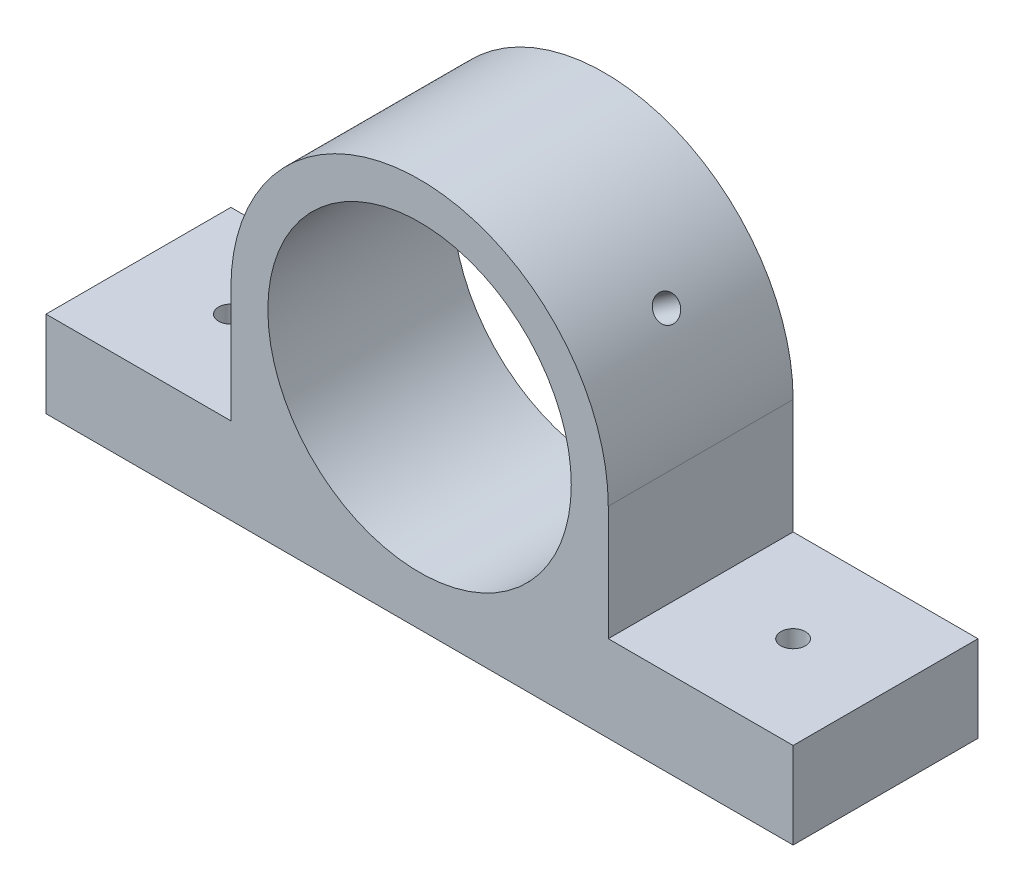
ISO-10303-21;
HEADER;
FILE_DESCRIPTION(('STEP AP214'),'2;1');
FILE_NAME('part.step','',(''),(''),'','','');
FILE_SCHEMA(('AUTOMOTIVE_DESIGN { 1 0 10303 214 1 1 1 1 }'));
ENDSEC;
DATA;
#1=APPLICATION_CONTEXT('core data for automotive mechanical design processes');
#2=APPLICATION_PROTOCOL_DEFINITION('international standard','automotive_design',2000,#1);
#3=PRODUCT_CONTEXT('',#1,'mechanical');
#4=PRODUCT('Part','Part','',(#3));
#5=PRODUCT_RELATED_PRODUCT_CATEGORY('part','',(#4));
#6=PRODUCT_DEFINITION_FORMATION('','',#4);
#7=PRODUCT_DEFINITION_CONTEXT('part definition',#1,'design');
#8=PRODUCT_DEFINITION('design','',#6,#7);
#9=PRODUCT_DEFINITION_SHAPE('','',#8);
#10=(LENGTH_UNIT() NAMED_UNIT(*) SI_UNIT(.MILLI.,.METRE.));
#11=(NAMED_UNIT(*) PLANE_ANGLE_UNIT() SI_UNIT($,.RADIAN.));
#12=(NAMED_UNIT(*) SI_UNIT($,.STERADIAN.) SOLID_ANGLE_UNIT());
#13=UNCERTAINTY_MEASURE_WITH_UNIT(LENGTH_MEASURE(1.E-05),#10,'distance_accuracy_value','');
#14=(GEOMETRIC_REPRESENTATION_CONTEXT(3) GLOBAL_UNCERTAINTY_ASSIGNED_CONTEXT((#13)) GLOBAL_UNIT_ASSIGNED_CONTEXT((#10,
#11,#12)) REPRESENTATION_CONTEXT('',''));
#15=CARTESIAN_POINT('',(0.,0.,0.));
#16=DIRECTION('',(0.,0.,1.));
#17=DIRECTION('',(1.,0.,0.));
#18=AXIS2_PLACEMENT_3D('',#15,#16,#17);
#19=CARTESIAN_POINT('',(0.,0.,15.));
#20=DIRECTION('',(0.,0.,-1.));
#21=DIRECTION('',(-1.,0.,0.));
#22=AXIS2_PLACEMENT_3D('',#19,#20,#21);
#23=CYLINDRICAL_SURFACE('',#22,12.31);
#24=CARTESIAN_POINT('',(-10.6240112154461,6.21823815031838,7.5));
#25=CARTESIAN_POINT('',(-10.6240102513348,6.21824046803629,7.55607092187762));
#26=CARTESIAN_POINT('',(-10.6216154189541,6.22233703949751,7.61218013980182));
#27=CARTESIAN_POINT('',(-10.6120708978465,6.23860054249658,7.72284646624698));
#28=CARTESIAN_POINT('',(-10.6049158047625,6.25077664674311,7.77740173706544));
#29=CARTESIAN_POINT('',(-10.5859807974809,6.2827903313855,7.88334130958704));
#30=CARTESIAN_POINT('',(-10.5742034846253,6.30262360229782,7.93472737609855));
#31=CARTESIAN_POINT('',(-10.5462437321525,6.34929757060097,8.03289689835184));
#32=CARTESIAN_POINT('',(-10.5300622418626,6.37613675780461,8.07968134302519));
#33=CARTESIAN_POINT('',(-10.4935631253158,6.43602841481695,8.16744639549157));
#34=CARTESIAN_POINT('',(-10.473236607093,6.46909423019128,8.20841419936927));
#35=CARTESIAN_POINT('',(-10.428881205234,6.54035890828077,8.28327308386673));
#36=CARTESIAN_POINT('',(-10.4048521607671,6.57855799396604,8.31716385692326));
#37=CARTESIAN_POINT('',(-10.3535793156497,6.65896151059522,8.37694897203239));
#38=CARTESIAN_POINT('',(-10.3263311481547,6.70117136673995,8.40283227551016));
#39=CARTESIAN_POINT('',(-10.2692875768624,6.78826484588403,8.44579710756561));
#40=CARTESIAN_POINT('',(-10.2394922156869,6.83314842414068,8.46287878338564));
#41=CARTESIAN_POINT('',(-10.1781785032019,6.92414500287402,8.48771872666184));
#42=CARTESIAN_POINT('',(-10.14666413373,6.97025504516167,8.4954976575197));
#43=CARTESIAN_POINT('',(-10.0827066964634,7.06245516400876,8.50157516591855));
#44=CARTESIAN_POINT('',(-10.0502636451773,7.10854524090835,8.49987391187969));
#45=CARTESIAN_POINT('',(-9.98546083519942,7.19928983497777,8.4870562575317));
#46=CARTESIAN_POINT('',(-9.95310106057067,7.24394748229757,8.47596207818315));
#47=CARTESIAN_POINT('',(-9.88936536228766,7.3307197954879,8.44470804016469));
#48=CARTESIAN_POINT('',(-9.85798944760154,7.37283443818145,8.4245480988835));
#49=CARTESIAN_POINT('',(-9.79717552006538,7.4534560656579,8.37570999281065));
#50=CARTESIAN_POINT('',(-9.76773982380786,7.49195876022733,8.34702186277538));
#51=CARTESIAN_POINT('',(-9.71181179259547,7.56431796496114,8.28194896664264));
#52=CARTESIAN_POINT('',(-9.68531951434267,7.59817438562255,8.24556405231335));
#53=CARTESIAN_POINT('',(-9.63610650578535,7.66049189237492,8.16600515332303));
#54=CARTESIAN_POINT('',(-9.61339689032018,7.68893711200971,8.1228118625328));
#55=CARTESIAN_POINT('',(-9.57264308603379,7.73961661245691,8.03092963131374));
#56=CARTESIAN_POINT('',(-9.55459890078668,7.76185088851121,7.98224068667481));
#57=CARTESIAN_POINT('',(-9.52382923132707,7.79957513896051,7.88073579219327));
#58=CARTESIAN_POINT('',(-9.51110435732678,7.81506433959329,7.82791936968574));
#59=CARTESIAN_POINT('',(-9.49145053450848,7.83892261541751,7.71966517697104));
#60=CARTESIAN_POINT('',(-9.48452146997801,7.8472918327584,7.66422745912098));
#61=CARTESIAN_POINT('',(-9.47673258609978,7.85669634276024,7.55247380413279));
#62=CARTESIAN_POINT('',(-9.4758554937068,7.85775250776881,7.49616082654741));
#63=CARTESIAN_POINT('',(-9.4801580108983,7.85256104794118,7.38410629078508));
#64=CARTESIAN_POINT('',(-9.48533756684054,7.84631348779227,7.32836472755167));
#65=CARTESIAN_POINT('',(-9.50154628908876,7.82667733868032,7.21911271379666));
#66=CARTESIAN_POINT('',(-9.5125674583548,7.81329851212297,7.16559932071826));
#67=CARTESIAN_POINT('',(-9.54004506944323,7.77972415410643,7.06223158225791));
#68=CARTESIAN_POINT('',(-9.55650159420988,7.75952851862172,7.01237729272856));
#69=CARTESIAN_POINT('',(-9.59429538206725,7.71274911469953,6.91761931106345));
#70=CARTESIAN_POINT('',(-9.61564358338163,7.68615102296471,6.87272705309226));
#71=CARTESIAN_POINT('',(-9.66244365833531,7.62723372055232,6.78928298099671));
#72=CARTESIAN_POINT('',(-9.68789559910918,7.59491441627852,6.75073127062052));
#73=CARTESIAN_POINT('',(-9.74209327663646,7.52526852843512,6.68097056667151));
#74=CARTESIAN_POINT('',(-9.77084664261782,7.48793031132263,6.64977911100062));
#75=CARTESIAN_POINT('',(-9.83063864042702,7.4092564935645,6.59574462396436));
#76=CARTESIAN_POINT('',(-9.86167725039315,7.36792093115817,6.57290151274728));
#77=CARTESIAN_POINT('',(-9.92500241583759,7.28239332471345,6.53624231000768));
#78=CARTESIAN_POINT('',(-9.95728741811328,7.23820479249796,6.52241534452836));
#79=CARTESIAN_POINT('',(-10.022145058774,7.14813170786569,6.50414538507261));
#80=CARTESIAN_POINT('',(-10.0547176920017,7.10224718581152,6.49970222318448));
#81=CARTESIAN_POINT('',(-10.1191016869787,7.01020871984523,6.5003279124755));
#82=CARTESIAN_POINT('',(-10.1509149702258,6.96405593171445,6.50536941903272));
#83=CARTESIAN_POINT('',(-10.2130018459883,6.87268110786441,6.52476434922127));
#84=CARTESIAN_POINT('',(-10.243275436329,6.82745907345979,6.53911778600441));
#85=CARTESIAN_POINT('',(-10.3015029896773,6.73928259232204,6.57672226354301));
#86=CARTESIAN_POINT('',(-10.3294570707946,6.6963280301694,6.59997285091534));
#87=CARTESIAN_POINT('',(-10.3823801822656,6.6139761588486,6.65470844951559));
#88=CARTESIAN_POINT('',(-10.4073492632173,6.57457878938612,6.68619332113738));
#89=CARTESIAN_POINT('',(-10.4538151079844,6.500444006453,6.75660632198164));
#90=CARTESIAN_POINT('',(-10.4753021466108,6.46571968890057,6.79555465685756));
#91=CARTESIAN_POINT('',(-10.5142803750531,6.40214048940853,6.8797531112261));
#92=CARTESIAN_POINT('',(-10.5317705947904,6.37328703258722,6.92500475633159));
#93=CARTESIAN_POINT('',(-10.5624343554179,6.32233888865318,7.02060895913213));
#94=CARTESIAN_POINT('',(-10.5756000688328,6.30025646204127,7.07097055273966));
#95=CARTESIAN_POINT('',(-10.5973135988659,6.26366517239838,7.17526474707009));
#96=CARTESIAN_POINT('',(-10.6058667362664,6.24914758369412,7.2291931523385));
#97=CARTESIAN_POINT('',(-10.6160232788843,6.23187029863441,7.31953424482988));
#98=CARTESIAN_POINT('',(-10.6190160620265,6.22676591108353,7.35536554884967));
#99=CARTESIAN_POINT('',(-10.6230103396829,6.21994909142392,7.42745922546475));
#100=CARTESIAN_POINT('',(-10.624011839235,6.21823665073355,7.46372159696922));
#101=CARTESIAN_POINT('',(-10.6240112154461,6.21823815031838,7.5));
#102=B_SPLINE_CURVE_WITH_KNOTS('',3,(#24,#25,#26,#27,#28,#29,#30,#31,#32,#33,#34,#35,#36,#37,
#38,#39,#40,#41,#42,#43,#44,#45,#46,#47,#48,#49,#50,#51,#52,#53,#54,#55,#56,#57,#58,#59,#60,#61,
#62,#63,#64,#65,#66,#67,#68,#69,#70,#71,#72,#73,#74,#75,#76,#77,#78,#79,#80,#81,#82,#83,#84,#85,
#86,#87,#88,#89,#90,#91,#92,#93,#94,#95,#96,#97,#98,#99,#100,#101),.UNSPECIFIED.,.T.,.F.,(4,2,2,
2,2,2,2,2,2,2,2,2,2,2,2,2,2,2,2,2,2,2,2,2,2,2,2,2,2,2,2,2,2,2,2,2,2,2,4),(0.,0.168080308730756,
0.336351766582701,0.504528658326744,0.672669327948602,0.8411745629209,1.00968711949947,
1.17843095188191,1.34717196125843,1.51553746015705,1.68389996796933,1.85186528784205,
2.01983213832109,2.18799603584784,2.35616317232615,2.52481604614801,2.69346904917204,
2.86214139415479,3.03081037153962,3.19899774782573,3.36718363452902,3.53513987088274,
3.70309867038949,3.87143677052742,4.03977762484889,4.20851563769228,4.37725203651824,
4.54578455191345,4.71431405159974,4.88235841944973,5.05040302463972,5.21843906771291,
5.38647226204538,5.5549669652107,5.72350252084615,5.89234147069191,6.06098523949513,
6.16973502288986,6.27848453114623),.UNSPECIFIED.);
#103=CARTESIAN_POINT('',(-10.6240112154461,6.21823815031838,7.5));
#104=VERTEX_POINT('',#103);
#105=EDGE_CURVE('E219',#104,#104,#102,.T.);
#106=ORIENTED_EDGE('',*,*,#105,.T.);
#107=EDGE_LOOP('',(#106));
#108=FACE_BOUND('',#107,.T.);
#109=CARTESIAN_POINT('',(9.47685834274403,7.85654223889638,7.5));
#110=CARTESIAN_POINT('',(9.47686019094095,7.85654054022186,7.55607092187762));
#111=CARTESIAN_POINT('',(9.4798906279995,7.85288902394741,7.61218013980182));
#112=CARTESIAN_POINT('',(9.49190890327866,7.83835766226694,7.72284646624697));
#113=CARTESIAN_POINT('',(9.50090351262693,7.82746960117528,7.77740173706544));
#114=CARTESIAN_POINT('',(9.52451038194525,7.79872718954853,7.88334130958703));
#115=CARTESIAN_POINT('',(9.53911948203674,7.78087675740538,7.93472737609855));
#116=CARTESIAN_POINT('',(9.5734158670859,7.73863974699905,8.03289689835184));
#117=CARTESIAN_POINT('',(9.59310205762088,7.71425457732621,8.07968134302519));
#118=CARTESIAN_POINT('',(9.63689837268942,7.65947247372659,8.16744639549157));
#119=CARTESIAN_POINT('',(9.66101799672108,7.62906261963285,8.20841419936927));
#120=CARTESIAN_POINT('',(9.71281444794334,7.56300822039966,8.28327308386673));
#121=CARTESIAN_POINT('',(9.74049142965003,7.52736344786864,8.31716385692326));
#122=CARTESIAN_POINT('',(9.79850967507594,7.45168311138373,8.37694897203239));
#123=CARTESIAN_POINT('',(9.82885454326757,7.41164158841033,8.40283227551016));
#124=CARTESIAN_POINT('',(9.89118559250863,7.32825044118411,8.44579710756561));
#125=CARTESIAN_POINT('',(9.92317174609117,7.28490087228549,8.46287878338564));
#126=CARTESIAN_POINT('',(9.98771003491172,7.19616216620984,8.48771872666184));
#127=CARTESIAN_POINT('',(10.02026075223,7.15077778249643,8.4954976575197));
#128=CARTESIAN_POINT('',(10.0850257916855,7.0591431527899,8.50157516591855));
#129=CARTESIAN_POINT('',(10.1172401197887,7.01289292219351,8.49987391187969));
#130=CARTESIAN_POINT('',(10.1803482788554,6.92096172078142,8.48705625753169));
#131=CARTESIAN_POINT('',(10.211245045747,6.87527966441558,8.47596207818315));
#132=CARTESIAN_POINT('',(10.2709854554787,6.78570982006434,8.44470804016469));
#133=CARTESIAN_POINT('',(10.299829079607,6.74182204843323,8.4245480988835));
#134=CARTESIAN_POINT('',(10.3547890398102,6.65710142890185,8.37570999281065));
#135=CARTESIAN_POINT('',(10.3809021367246,6.6162722252259,8.34702186277538));
#136=CARTESIAN_POINT('',(10.4297690342077,6.53896876142654,8.28194896664264));
#137=CARTESIAN_POINT('',(10.4525227700644,6.50249458519747,8.24556405231335));
#138=CARTESIAN_POINT('',(10.4942502310651,6.43493564161834,8.16600515332303));
#139=CARTESIAN_POINT('',(10.5132128481163,6.40386674544842,8.1228118625328));
#140=CARTESIAN_POINT('',(10.5468973787286,6.34823728628492,8.03092963131374));
#141=CARTESIAN_POINT('',(10.5616192890409,6.32367672827728,7.98224068667481));
#142=CARTESIAN_POINT('',(10.5865446420541,6.28186024339654,7.88073579219327));
#143=CARTESIAN_POINT('',(10.5967475663612,6.26460515457762,7.82791936968574));
#144=CARTESIAN_POINT('',(10.6124450088007,6.23797659138811,7.71966517697104));
#145=CARTESIAN_POINT('',(10.6179396209339,6.22860295966543,7.66422745912098));
#146=CARTESIAN_POINT('',(10.6241130144043,6.21806727110216,7.55247380413279));
#147=CARTESIAN_POINT('',(10.6248055016033,6.21688184414513,7.49616082654741));
#148=CARTESIAN_POINT('',(10.6213986726586,6.2227004716351,7.38410629078508));
#149=CARTESIAN_POINT('',(10.6172993989545,6.22970445355053,7.32836472755168));
#150=CARTESIAN_POINT('',(10.6043911640398,6.25165162877319,7.21911271379666));
#151=CARTESIAN_POINT('',(10.5955886413411,6.2665839683816,7.16559932071826));
#152=CARTESIAN_POINT('',(10.573436961348,6.3038875834991,7.06223158225791));
#153=CARTESIAN_POINT('',(10.5600877346703,6.32625897252913,7.01237729272856));
#154=CARTESIAN_POINT('',(10.5290557107397,6.37777301452441,6.91761931106346));
#155=CARTESIAN_POINT('',(10.5113631950828,6.40693084491392,6.87272705309226));
#156=CARTESIAN_POINT('',(10.4720056091125,6.47105943421557,6.78928298099671));
#157=CARTESIAN_POINT('',(10.4503404738089,6.50603028822536,6.75073127062053));
#158=CARTESIAN_POINT('',(10.4034314443702,6.58077974240373,6.68097056667152));
#159=CARTESIAN_POINT('',(10.3781792276303,6.6205694906075,6.64977911100062));
#160=CARTESIAN_POINT('',(10.3247000892944,6.70366362015647,6.59574462396436));
#161=CARTESIAN_POINT('',(10.2964731961543,6.74696796787975,6.57290151274728));
#162=CARTESIAN_POINT('',(10.2377620176662,6.83572632277247,6.53624231000768));
#163=CARTESIAN_POINT('',(10.2072805011255,6.88117766929468,6.52241534452836));
#164=CARTESIAN_POINT('',(10.1448221077197,6.97293072494085,6.50414538507261));
#165=CARTESIAN_POINT('',(10.1128452576222,7.01923241883393,6.49970222318448));
#166=CARTESIAN_POINT('',(10.0483780135151,7.11121259313177,6.5003279124755));
#167=CARTESIAN_POINT('',(10.0158893627757,7.15689248385336,6.50536941903272));
#168=CARTESIAN_POINT('',(9.95126007722516,7.24648709320458,6.52476434922127));
#169=CARTESIAN_POINT('',(9.91911944290556,7.29040180934106,6.53911778600441));
#170=CARTESIAN_POINT('',(9.85617565039521,7.37527594426552,6.57672226354301));
#171=CARTESIAN_POINT('',(9.82537242414156,7.41623551351621,6.59997285091534));
#172=CARTESIAN_POINT('',(9.76608774852405,7.49413296966682,6.65470844951559));
#173=CARTESIAN_POINT('',(9.7376062598076,7.53107092473518,6.68619332113738));
#174=CARTESIAN_POINT('',(9.68383460622877,7.60009012526562,6.75660632198164));
#175=CARTESIAN_POINT('',(9.65855342129356,7.63215775297152,6.79555465685756));
#176=CARTESIAN_POINT('',(9.61213985597385,7.69053067353288,6.8797531112261));
#177=CARTESIAN_POINT('',(9.59100848297604,7.7168345673934,6.92500475633159));
#178=CARTESIAN_POINT('',(9.5536205118832,7.76307436847107,7.02060895913213));
#179=CARTESIAN_POINT('',(9.53737275773609,7.78299872692921,7.07097055273966));
#180=CARTESIAN_POINT('',(9.51041465752766,7.8159177290007,7.17526474707009));
#181=CARTESIAN_POINT('',(9.49969793183027,7.8289203568699,7.2291931523385));
#182=CARTESIAN_POINT('',(9.48693633671429,7.84437356453299,7.31953424482988));
#183=CARTESIAN_POINT('',(9.48316337351835,7.84893166412911,7.35536554884967));
#184=CARTESIAN_POINT('',(9.47812378180352,7.85501654700521,7.42745922546475));
#185=CARTESIAN_POINT('',(9.4768571469436,7.85654333795444,7.46372159696922));
#186=CARTESIAN_POINT('',(9.47685834274403,7.85654223889638,7.5));
#187=B_SPLINE_CURVE_WITH_KNOTS('',3,(#109,#110,#111,#112,#113,#114,#115,#116,#117,#118,#119,
#120,#121,#122,#123,#124,#125,#126,#127,#128,#129,#130,#131,#132,#133,#134,#135,#136,#137,#138,
#139,#140,#141,#142,#143,#144,#145,#146,#147,#148,#149,#150,#151,#152,#153,#154,#155,#156,#157,
#158,#159,#160,#161,#162,#163,#164,#165,#166,#167,#168,#169,#170,#171,#172,#173,#174,#175,#176,
#177,#178,#179,#180,#181,#182,#183,#184,#185,#186),.UNSPECIFIED.,.T.,.F.,(4,2,2,2,2,2,2,2,2,2,2,
2,2,2,2,2,2,2,2,2,2,2,2,2,2,2,2,2,2,2,2,2,2,2,2,2,2,2,4),(0.,0.168080308730753,
0.336351766582699,0.504528658326742,0.672669327948599,0.841174562920897,1.00968711949947,
1.17843095188191,1.34717196125842,1.51553746015704,1.68389996796933,1.85186528784205,
2.01983213832108,2.18799603584784,2.35616317232614,2.524816046148,2.69346904917203,
2.86214139415479,3.03081037153961,3.19899774782572,3.36718363452901,3.53513987088274,
3.70309867038949,3.87143677052741,4.03977762484888,4.20851563769227,4.37725203651823,
4.54578455191344,4.71431405159973,4.88235841944972,5.05040302463971,5.21843906771289,
5.38647226204537,5.55496696521069,5.72350252084614,5.8923414706919,6.06098523949512,
6.16973502288985,6.27848453114622),.UNSPECIFIED.);
#188=CARTESIAN_POINT('',(9.47685834274403,7.85654223889638,7.5));
#189=VERTEX_POINT('',#188);
#190=EDGE_CURVE('E210',#189,#189,#187,.T.);
#191=ORIENTED_EDGE('',*,*,#190,.T.);
#192=EDGE_LOOP('',(#191));
#193=FACE_BOUND('',#192,.T.);
#194=CARTESIAN_POINT('',(0.,0.,0.));
#195=DIRECTION('',(0.,0.,-1.));
#196=DIRECTION('',(1.,0.,0.));
#197=AXIS2_PLACEMENT_3D('',#194,#195,#196);
#198=CIRCLE('',#197,12.31);
#199=CARTESIAN_POINT('',(12.31,0.,0.));
#200=VERTEX_POINT('',#199);
#201=EDGE_CURVE('E142',#200,#200,#198,.T.);
#202=ORIENTED_EDGE('',*,*,#201,.T.);
#203=EDGE_LOOP('',(#202));
#204=FACE_BOUND('',#203,.T.);
#205=CARTESIAN_POINT('',(0.,0.,15.));
#206=DIRECTION('',(0.,0.,-1.));
#207=DIRECTION('',(1.,0.,0.));
#208=AXIS2_PLACEMENT_3D('',#205,#206,#207);
#209=CIRCLE('',#208,12.31);
#210=CARTESIAN_POINT('',(12.31,0.,15.));
#211=VERTEX_POINT('',#210);
#212=EDGE_CURVE('E166',#211,#211,#209,.T.);
#213=ORIENTED_EDGE('',*,*,#212,.F.);
#214=EDGE_LOOP('',(#213));
#215=FACE_BOUND('',#214,.T.);
#216=ADVANCED_FACE('F39',(#108,#193,#204,#215),#23,.F.);
#217=CARTESIAN_POINT('',(30.31,-12.31,15.));
#218=DIRECTION('',(-1.,0.,0.));
#219=DIRECTION('',(0.,0.,1.));
#220=AXIS2_PLACEMENT_3D('',#217,#218,#219);
#221=PLANE('',#220);
#222=DIRECTION('',(0.,1.,0.));
#223=VECTOR('',#222,1.);
#224=CARTESIAN_POINT('',(30.31,-12.31,0.));
#225=LINE('',#224,#223);
#226=CARTESIAN_POINT('',(30.31,-16.31,0.));
#227=VERTEX_POINT('',#226);
#228=CARTESIAN_POINT('',(30.31,-9.31,0.));
#229=VERTEX_POINT('',#228);
#230=EDGE_CURVE('E146',#227,#229,#225,.T.);
#231=ORIENTED_EDGE('',*,*,#230,.T.);
#232=DIRECTION('',(0.,0.,-1.));
#233=VECTOR('',#232,1.);
#234=CARTESIAN_POINT('',(30.31,-9.31,15.));
#235=LINE('',#234,#233);
#236=CARTESIAN_POINT('',(30.31,-9.31,15.));
#237=VERTEX_POINT('',#236);
#238=EDGE_CURVE('E177',#237,#229,#235,.T.);
#239=ORIENTED_EDGE('',*,*,#238,.F.);
#240=DIRECTION('',(0.,1.,0.));
#241=VECTOR('',#240,1.);
#242=CARTESIAN_POINT('',(30.31,-12.31,15.));
#243=LINE('',#242,#241);
#244=CARTESIAN_POINT('',(30.31,-16.31,15.));
#245=VERTEX_POINT('',#244);
#246=EDGE_CURVE('E100',#245,#237,#243,.T.);
#247=ORIENTED_EDGE('',*,*,#246,.F.);
#248=DIRECTION('',(0.,0.,1.));
#249=VECTOR('',#248,1.);
#250=CARTESIAN_POINT('',(30.31,-16.31,0.));
#251=LINE('',#250,#249);
#252=EDGE_CURVE('E147',#227,#245,#251,.T.);
#253=ORIENTED_EDGE('',*,*,#252,.F.);
#254=EDGE_LOOP('',(#231,#239,#247,#253));
#255=FACE_BOUND('',#254,.T.);
#256=ADVANCED_FACE('F262',(#255),#221,.F.);
#257=CARTESIAN_POINT('',(30.31,-9.31,15.));
#258=DIRECTION('',(0.,-1.,0.));
#259=DIRECTION('',(0.,0.,-1.));
#260=AXIS2_PLACEMENT_3D('',#257,#258,#259);
#261=PLANE('',#260);
#262=CARTESIAN_POINT('',(22.81,-9.31,7.5));
#263=DIRECTION('',(0.,1.,0.));
#264=DIRECTION('',(0.,0.,1.));
#265=AXIS2_PLACEMENT_3D('',#262,#263,#264);
#266=CIRCLE('',#265,1.);
#267=CARTESIAN_POINT('',(22.81,-9.31,8.5));
#268=VERTEX_POINT('',#267);
#269=EDGE_CURVE('E186',#268,#268,#266,.T.);
#270=ORIENTED_EDGE('',*,*,#269,.F.);
#271=EDGE_LOOP('',(#270));
#272=FACE_BOUND('',#271,.T.);
#273=DIRECTION('',(-1.,0.,0.));
#274=VECTOR('',#273,1.);
#275=CARTESIAN_POINT('',(30.31,-9.31,0.));
#276=LINE('',#275,#274);
#277=CARTESIAN_POINT('',(15.31,-9.31,0.));
#278=VERTEX_POINT('',#277);
#279=EDGE_CURVE('E150',#229,#278,#276,.T.);
#280=ORIENTED_EDGE('',*,*,#279,.T.);
#281=DIRECTION('',(0.,0.,-1.));
#282=VECTOR('',#281,1.);
#283=CARTESIAN_POINT('',(15.31,-9.31,15.));
#284=LINE('',#283,#282);
#285=CARTESIAN_POINT('',(15.31,-9.31,15.));
#286=VERTEX_POINT('',#285);
#287=EDGE_CURVE('E173',#286,#278,#284,.T.);
#288=ORIENTED_EDGE('',*,*,#287,.F.);
#289=DIRECTION('',(-1.,0.,0.));
#290=VECTOR('',#289,1.);
#291=CARTESIAN_POINT('',(30.31,-9.31,15.));
#292=LINE('',#291,#290);
#293=EDGE_CURVE('E247',#237,#286,#292,.T.);
#294=ORIENTED_EDGE('',*,*,#293,.F.);
#295=ORIENTED_EDGE('',*,*,#238,.T.);
#296=EDGE_LOOP('',(#280,#288,#294,#295));
#297=FACE_BOUND('',#296,.T.);
#298=ADVANCED_FACE('F266',(#272,#297),#261,.F.);
#299=CARTESIAN_POINT('',(15.31,-9.31,15.));
#300=DIRECTION('',(-1.,0.,0.));
#301=DIRECTION('',(0.,0.,1.));
#302=AXIS2_PLACEMENT_3D('',#299,#300,#301);
#303=PLANE('',#302);
#304=DIRECTION('',(0.,1.,0.));
#305=VECTOR('',#304,1.);
#306=CARTESIAN_POINT('',(15.31,-9.31,0.));
#307=LINE('',#306,#305);
#308=CARTESIAN_POINT('',(15.31,0.,0.));
#309=VERTEX_POINT('',#308);
#310=EDGE_CURVE('E153',#278,#309,#307,.T.);
#311=ORIENTED_EDGE('',*,*,#310,.T.);
#312=DIRECTION('',(0.,0.,-1.));
#313=VECTOR('',#312,1.);
#314=CARTESIAN_POINT('',(15.31,0.,15.));
#315=LINE('',#314,#313);
#316=CARTESIAN_POINT('',(15.31,0.,15.));
#317=VERTEX_POINT('',#316);
#318=EDGE_CURVE('E128',#317,#309,#315,.T.);
#319=ORIENTED_EDGE('',*,*,#318,.F.);
#320=DIRECTION('',(0.,1.,0.));
#321=VECTOR('',#320,1.);
#322=CARTESIAN_POINT('',(15.31,-9.31,15.));
#323=LINE('',#322,#321);
#324=EDGE_CURVE('E117',#286,#317,#323,.T.);
#325=ORIENTED_EDGE('',*,*,#324,.F.);
#326=ORIENTED_EDGE('',*,*,#287,.T.);
#327=EDGE_LOOP('',(#311,#319,#325,#326));
#328=FACE_BOUND('',#327,.T.);
#329=ADVANCED_FACE('F271',(#328),#303,.F.);
#330=CARTESIAN_POINT('',(0.,0.,15.));
#331=DIRECTION('',(0.,0.,-1.));
#332=DIRECTION('',(-1.,0.,0.));
#333=AXIS2_PLACEMENT_3D('',#330,#331,#332);
#334=CYLINDRICAL_SURFACE('',#333,15.31);
#335=CARTESIAN_POINT('',(-13.0880134507287,7.94355108962884,7.5));
#336=CARTESIAN_POINT('',(-13.0880123937047,7.94355336090083,7.44389387788978));
#337=CARTESIAN_POINT('',(-13.0855519120547,7.94761118390756,7.38774859911552));
#338=CARTESIAN_POINT('',(-13.0757509244675,7.96372546384369,7.27700872601508));
#339=CARTESIAN_POINT('',(-13.0684047562223,7.97579120158004,7.22241600768404));
#340=CARTESIAN_POINT('',(-13.0489816908364,8.00752901597971,7.11640134298383));
#341=CARTESIAN_POINT('',(-13.0369073126924,8.02719704238258,7.06497772510341));
#342=CARTESIAN_POINT('',(-13.008278780071,8.07350733336953,6.96674050703604));
#343=CARTESIAN_POINT('',(-12.991725643269,8.10014801356374,6.91992586287753));
#344=CARTESIAN_POINT('',(-12.9544612431709,8.15961170317107,6.83214591708209));
#345=CARTESIAN_POINT('',(-12.9337440338656,8.1924435489513,6.7911891248463));
#346=CARTESIAN_POINT('',(-12.8886222303802,8.26324849112294,6.7163603614226));
#347=CARTESIAN_POINT('',(-12.8642174816209,8.30122180303433,6.68248868738022));
#348=CARTESIAN_POINT('',(-12.812263513999,8.38118580729651,6.62276527337126));
#349=CARTESIAN_POINT('',(-12.7847115516528,8.42317999948402,6.59692060480074));
#350=CARTESIAN_POINT('',(-12.727156610916,8.50989363929746,6.55403010861167));
#351=CARTESIAN_POINT('',(-12.6971536607358,8.55461305555524,6.5369841797384));
#352=CARTESIAN_POINT('',(-12.6355203833497,8.64538769406633,6.51219872956659));
#353=CARTESIAN_POINT('',(-12.6038924625783,8.69144089934734,6.50444583808023));
#354=CARTESIAN_POINT('',(-12.5398348657632,8.78360920181223,6.49842524461789));
#355=CARTESIAN_POINT('',(-12.5074051994587,8.82972429823787,6.50015742747909));
#356=CARTESIAN_POINT('',(-12.4427250691544,8.92063906659039,6.51304679469622));
#357=CARTESIAN_POINT('',(-12.4104744072509,8.96544063787248,6.52418959724648));
#358=CARTESIAN_POINT('',(-12.3470658061588,9.05256709277853,6.55556157735139));
#359=CARTESIAN_POINT('',(-12.3159078739063,9.09489196068298,6.57579081257012));
#360=CARTESIAN_POINT('',(-12.2556274038172,9.17596062209599,6.62477767904203));
#361=CARTESIAN_POINT('',(-12.2265064403291,9.21470165299808,6.65354181875221));
#362=CARTESIAN_POINT('',(-12.1712589608329,9.28755343743493,6.71877725199931));
#363=CARTESIAN_POINT('',(-12.1451324817379,9.32166413389238,6.75524864052796));
#364=CARTESIAN_POINT('',(-12.0966907046854,9.38444205146093,6.8349444880839));
#365=CARTESIAN_POINT('',(-12.0743826154565,9.41309898759068,6.87818143166411));
#366=CARTESIAN_POINT('',(-12.0343961453561,9.46416741052095,6.97013733882547));
#367=CARTESIAN_POINT('',(-12.0167177665143,9.48657889458354,7.01885630480985));
#368=CARTESIAN_POINT('',(-11.9866056875278,9.52459842721886,7.12040138610723));
#369=CARTESIAN_POINT('',(-11.974172319594,9.54020604484749,7.17322776132617));
#370=CARTESIAN_POINT('',(-11.9549941393893,9.56422780133048,7.28148438896626));
#371=CARTESIAN_POINT('',(-11.9482492539954,9.57264203265293,7.33691460790639));
#372=CARTESIAN_POINT('',(-11.9406978596797,9.58205989134708,7.44869586464494));
#373=CARTESIAN_POINT('',(-11.939880406296,9.58307717651395,7.50504501273093));
#374=CARTESIAN_POINT('',(-11.9441844306497,9.57771213055308,7.61716091620611));
#375=CARTESIAN_POINT('',(-11.9493058745938,9.57132984153016,7.67292767490739));
#376=CARTESIAN_POINT('',(-11.9652962309028,9.55133226757506,7.78224630747657));
#377=CARTESIAN_POINT('',(-11.9761601219888,9.53772330170558,7.83580007237701));
#378=CARTESIAN_POINT('',(-12.003246458245,9.50361226237272,7.939230914909));
#379=CARTESIAN_POINT('',(-12.0194689564851,9.48311012064151,7.98910795612148));
#380=CARTESIAN_POINT('',(-12.056734230079,9.43568582706979,8.08384971468847));
#381=CARTESIAN_POINT('',(-12.0777840300877,9.40875431689351,8.12870698435562));
#382=CARTESIAN_POINT('',(-12.1239715183852,9.34916210189705,8.21206081170927));
#383=CARTESIAN_POINT('',(-12.1491092502746,9.31650133597022,8.25055730154494));
#384=CARTESIAN_POINT('',(-12.202676574127,9.24622818195452,8.32015586260376));
#385=CARTESIAN_POINT('',(-12.2311111026235,9.20860835646447,8.35124662642837));
#386=CARTESIAN_POINT('',(-12.2903181667826,9.12943697521219,8.40507378256156));
#387=CARTESIAN_POINT('',(-12.3210906869468,9.08788544551244,8.42781023024436));
#388=CARTESIAN_POINT('',(-12.3839806823585,9.00199704838549,8.46426371094916));
#389=CARTESIAN_POINT('',(-12.4160970718938,8.95766241547538,8.47798788085505));
#390=CARTESIAN_POINT('',(-12.4807232700919,8.86739682310928,8.49605057996489));
#391=CARTESIAN_POINT('',(-12.5132330744569,8.82146588108115,8.5003892116037));
#392=CARTESIAN_POINT('',(-12.5776394043214,8.72938931927743,8.49955666266106));
#393=CARTESIAN_POINT('',(-12.6095369587592,8.68324425826167,8.49440316902244));
#394=CARTESIAN_POINT('',(-12.6718985427321,8.59198132591161,8.47476935520246));
#395=CARTESIAN_POINT('',(-12.7023625698019,8.54686345634399,8.46028901898098));
#396=CARTESIAN_POINT('',(-12.7610573126929,8.45897812493957,8.42241662221588));
#397=CARTESIAN_POINT('',(-12.7892880547389,8.41621063550465,8.39902466633788));
#398=CARTESIAN_POINT('',(-12.8428161602414,8.33430080486174,8.34399542434716));
#399=CARTESIAN_POINT('',(-12.8681135962118,8.29515837404386,8.31235834212414));
#400=CARTESIAN_POINT('',(-12.9152244440267,8.22161732586988,8.24167132933586));
#401=CARTESIAN_POINT('',(-12.9370316981442,8.18722710712442,8.20260855749171));
#402=CARTESIAN_POINT('',(-12.9766265246807,8.12432455152878,8.11819730579931));
#403=CARTESIAN_POINT('',(-12.9944131133314,8.09581365336833,8.07284729197094));
#404=CARTESIAN_POINT('',(-13.0255991229285,8.04554202805152,7.97709283254678));
#405=CARTESIAN_POINT('',(-13.0389927465042,8.0237902228055,7.92668182158926));
#406=CARTESIAN_POINT('',(-13.0610707652839,7.98780197462179,7.82232039307745));
#407=CARTESIAN_POINT('',(-13.0697606643414,7.97355674871442,7.76837419532457));
#408=CARTESIAN_POINT('',(-13.0800063596424,7.95673226925198,7.67841608847788));
#409=CARTESIAN_POINT('',(-13.0830061033619,7.95179642606435,7.64298534815944));
#410=CARTESIAN_POINT('',(-13.0870099851903,7.94520511288906,7.57170840405395));
#411=CARTESIAN_POINT('',(-13.0880141263628,7.94354963786548,7.53586220090478));
#412=CARTESIAN_POINT('',(-13.0880134507287,7.94355108962884,7.5));
#413=B_SPLINE_CURVE_WITH_KNOTS('',3,(#335,#336,#337,#338,#339,#340,#341,#342,#343,#344,#345,
#346,#347,#348,#349,#350,#351,#352,#353,#354,#355,#356,#357,#358,#359,#360,#361,#362,#363,#364,
#365,#366,#367,#368,#369,#370,#371,#372,#373,#374,#375,#376,#377,#378,#379,#380,#381,#382,#383,
#384,#385,#386,#387,#388,#389,#390,#391,#392,#393,#394,#395,#396,#397,#398,#399,#400,#401,#402,
#403,#404,#405,#406,#407,#408,#409,#410,#411,#412),.UNSPECIFIED.,.T.,.F.,(4,2,2,2,2,2,2,2,2,2,2,
2,2,2,2,2,2,2,2,2,2,2,2,2,2,2,2,2,2,2,2,2,2,2,2,2,2,2,4),(0.,0.168187444621569,
0.336570151973651,0.50486327368677,0.673118187454748,0.841615086688453,1.01011905116292,
1.17877104101199,1.34742108999314,1.51582820443225,1.68423327416458,1.85238144312653,
2.02053067920088,2.18880847172608,2.35708833839338,2.52568247762455,2.69427669076526,
2.86288158079558,3.03148430344536,3.19977563710811,3.36806601316964,3.5362094765382,
3.70435460519482,3.87274598776286,4.04113916645597,4.20978783064559,4.37843537697494,
4.54694920859341,4.71546120102292,4.88365951793662,5.05185812411537,5.22005475488797,
5.38824722680306,5.5567332451203,5.72526044374217,5.89400916016325,6.06255999360187,
6.17006307813755,6.27756599763771),.UNSPECIFIED.);
#414=CARTESIAN_POINT('',(-13.0880134507287,7.94355108962884,7.5));
#415=VERTEX_POINT('',#414);
#416=EDGE_CURVE('E11',#415,#415,#413,.T.);
#417=ORIENTED_EDGE('',*,*,#416,.T.);
#418=EDGE_LOOP('',(#417));
#419=FACE_BOUND('',#418,.T.);
#420=CARTESIAN_POINT('',(11.9408605780266,9.58185517820683,7.5));
#421=CARTESIAN_POINT('',(11.9408623508007,9.58185340810835,7.44389387788978));
#422=CARTESIAN_POINT('',(11.94383392285,9.57815345445195,7.38774859911552));
#423=CARTESIAN_POINT('',(11.9556242576159,9.56343213040644,7.27700872601508));
#424=CARTESIAN_POINT('',(11.964449804815,9.55240226496552,7.22241600768404));
#425=CARTESIAN_POINT('',(11.9876305151991,9.52329558191948,7.11640134298383));
#426=CARTESIAN_POINT('',(12.0019827339319,9.50522251666777,7.06497772510341));
#427=CARTESIAN_POINT('',(12.0357086378084,9.46248144345866,6.96674050703604));
#428=CARTESIAN_POINT('',(12.0550811821781,9.43781493369668,6.91992586287753));
#429=CARTESIAN_POINT('',(12.0982135970444,9.38246007226433,6.83214591708209));
#430=CARTESIAN_POINT('',(12.1219797373549,9.35176311095744,6.7911891248463));
#431=CARTESIAN_POINT('',(12.1730820533336,9.28514576871597,6.7163603614226));
#432=CARTESIAN_POINT('',(12.2004183786551,9.24922516881225,6.68248868738022));
#433=CARTESIAN_POINT('',(12.2577906599363,9.17305510861877,6.62276527337126));
#434=CARTESIAN_POINT('',(12.2878289663402,9.13280187328299,6.59692060480074));
#435=CARTESIAN_POINT('',(12.3496281847145,9.04906010866561,6.55403010861167));
#436=CARTESIAN_POINT('',(12.381389076857,9.00557161662151,6.5369841797384));
#437=CARTESIAN_POINT('',(12.4456095124551,8.91660852579306,6.5121987295666));
#438=CARTESIAN_POINT('',(12.4780679836259,8.87113687816257,6.50444583808024));
#439=CARTESIAN_POINT('',(12.5427688688788,8.77941901111103,6.49842524461789));
#440=CARTESIAN_POINT('',(12.5750112855793,8.73317280110111,6.50015742747909));
#441=CARTESIAN_POINT('',(12.6383213150836,8.6412986778404,6.51304679469622));
#442=CARTESIAN_POINT('',(12.6693906450104,8.59566992900309,6.52418959724648));
#443=CARTESIAN_POINT('',(12.7295757129273,8.50628633186807,6.5555615773514));
#444=CARTESIAN_POINT('',(12.7586914385181,8.46253149546446,6.57579081257012));
#445=CARTESIAN_POINT('',(12.8142539264053,8.37815926734856,6.62477767904204));
#446=CARTESIAN_POINT('',(12.8406986311596,8.33754429990691,6.65354181875221));
#447=CARTESIAN_POINT('',(12.8902611645503,8.2607118733527,6.71877725199931));
#448=CARTESIAN_POINT('',(12.9133789521766,8.2244944684487,6.75524864052796));
#449=CARTESIAN_POINT('',(12.9558028345336,8.15750277565023,6.8349444880839));
#450=CARTESIAN_POINT('',(12.9751017300737,8.12673877941561,6.87818143166411));
#451=CARTESIAN_POINT('',(13.0094141720216,8.071697359201,6.97013733882547));
#452=CARTESIAN_POINT('',(13.0244277165509,8.04741993806464,7.01885630480985));
#453=CARTESIAN_POINT('',(13.0498554532432,8.00612039364343,7.12040138610723));
#454=CARTESIAN_POINT('',(13.0602693540741,7.98909872992612,7.17322776132617));
#455=CARTESIAN_POINT('',(13.0762830974372,7.96286121091247,7.28148438896626));
#456=CARTESIAN_POINT('',(13.0818830018513,7.95364525527691,7.33691460790639));
#457=CARTESIAN_POINT('',(13.0881501652037,7.94332816838138,7.44869586464494));
#458=CARTESIAN_POINT('',(13.0888265150448,7.94221208145032,7.50504501273093));
#459=CARTESIAN_POINT('',(13.0852570839715,7.94809149516368,7.61716091620611));
#460=CARTESIAN_POINT('',(13.0810113310647,7.95508694965208,7.67292767490739));
#461=CARTESIAN_POINT('',(13.0676887823421,7.9769525425896,7.78224630747657));
#462=CARTESIAN_POINT('',(13.0586162071244,7.99181580133339,7.83580007237701));
#463=CARTESIAN_POINT('',(13.0358263877844,8.02893529419911,7.939230914909));
#464=CARTESIAN_POINT('',(13.0221090976625,8.05119160153939,7.98910795612148));
#465=CARTESIAN_POINT('',(12.9902903131628,8.10242956783163,8.08384971468847));
#466=CARTESIAN_POINT('',(12.9721824273995,8.13142102853931,8.12870698435562));
#467=CARTESIAN_POINT('',(12.9319811140784,8.19520480837933,8.21206081170927));
#468=CARTESIAN_POINT('',(12.9098876440114,8.22999718938249,8.25055730154493));
#469=CARTESIAN_POINT('',(12.8621735835251,8.3043688425302,8.32015586260375));
#470=CARTESIAN_POINT('',(12.8365476926286,8.34395529723992,8.35124662642837));
#471=CARTESIAN_POINT('',(12.782400938458,8.4266699456918,8.40507378256155));
#472=CARTESIAN_POINT('',(12.7538800943738,8.46979811595639,8.42781023024436));
#473=CARTESIAN_POINT('',(12.694681046627,8.55827094246145,8.46426371094915));
#474=CARTESIAN_POINT('',(12.6640045713881,8.60361381421625,8.47798788085505));
#475=CARTESIAN_POINT('',(12.6012861219011,8.69521522661082,8.49605057996489));
#476=CARTESIAN_POINT('',(12.5692441625599,8.74147375725142,8.5003892116037));
#477=CARTESIAN_POINT('',(12.504748759057,8.83348794902204,8.49955666266107));
#478=CARTESIAN_POINT('',(12.4722961918753,8.87924438593067,8.49440316902244));
#479=CARTESIAN_POINT('',(12.4078660056831,8.96905886741327,8.47476935520246));
#480=CARTESIAN_POINT('',(12.3758883874895,9.01311690906625,8.46028901898098));
#481=CARTESIAN_POINT('',(12.3133779744695,9.09833047948295,8.42241662221588));
#482=CARTESIAN_POINT('',(12.2828451626787,9.13948604232912,8.39902466633788));
#483=CARTESIAN_POINT('',(12.2241827895696,9.21780082009075,8.34399542434716));
#484=CARTESIAN_POINT('',(12.1960531688468,9.25496013379541,8.31235834212414));
#485=CARTESIAN_POINT('',(12.1430600474747,9.32438236968276,8.24167132933586));
#486=CARTESIAN_POINT('',(12.1182023328712,9.35663663300097,8.2026085574917));
#487=CARTESIAN_POINT('',(12.0726354937964,9.415357540399,8.11819730579931));
#488=CARTESIAN_POINT('',(12.0519273847826,9.44182276797812,8.07284729197094));
#489=CARTESIAN_POINT('',(12.0153537529097,9.48832193956438,7.97709283254678));
#490=CARTESIAN_POINT('',(11.9994946310862,9.50834738435189,7.92668182158926));
#491=CARTESIAN_POINT('',(11.9732278669804,9.54140264148262,7.82232039307745));
#492=CARTESIAN_POINT('',(11.9628138538349,9.55444062970885,7.76837419532457));
#493=CARTESIAN_POINT('',(11.9505082488108,9.56982274485515,7.67841608847788));
#494=CARTESIAN_POINT('',(11.9468960461669,9.57432973968707,7.64298534815944));
#495=CARTESIAN_POINT('',(11.9420716460516,9.58034651977265,7.57170840405395));
#496=CARTESIAN_POINT('',(11.9408594448958,9.58185630962752,7.53586220090478));
#497=CARTESIAN_POINT('',(11.9408605780266,9.58185517820683,7.5));
#498=B_SPLINE_CURVE_WITH_KNOTS('',3,(#420,#421,#422,#423,#424,#425,#426,#427,#428,#429,#430,
#431,#432,#433,#434,#435,#436,#437,#438,#439,#440,#441,#442,#443,#444,#445,#446,#447,#448,#449,
#450,#451,#452,#453,#454,#455,#456,#457,#458,#459,#460,#461,#462,#463,#464,#465,#466,#467,#468,
#469,#470,#471,#472,#473,#474,#475,#476,#477,#478,#479,#480,#481,#482,#483,#484,#485,#486,#487,
#488,#489,#490,#491,#492,#493,#494,#495,#496,#497),.UNSPECIFIED.,.T.,.F.,(4,2,2,2,2,2,2,2,2,2,2,
2,2,2,2,2,2,2,2,2,2,2,2,2,2,2,2,2,2,2,2,2,2,2,2,2,2,2,4),(0.,0.16818744462157,0.33657015197365,
0.504863273686769,0.673118187454748,0.841615086688452,1.01011905116292,1.17877104101198,
1.34742108999314,1.51582820443225,1.68423327416457,1.85238144312653,2.02053067920088,
2.18880847172608,2.35708833839337,2.52568247762454,2.69427669076525,2.86288158079557,
3.03148430344536,3.19977563710811,3.36806601316964,3.5362094765382,3.70435460519482,
3.87274598776286,4.04113916645596,4.20978783064558,4.37843537697493,4.5469492085934,
4.71546120102291,4.88365951793661,5.05185812411537,5.22005475488797,5.38824722680305,
5.55673324512029,5.72526044374216,5.89400916016325,6.06255999360186,6.17006307813754,
6.2775659976377),.UNSPECIFIED.);
#499=CARTESIAN_POINT('',(11.9408605780266,9.58185517820683,7.5));
#500=VERTEX_POINT('',#499);
#501=EDGE_CURVE('E54',#500,#500,#498,.T.);
#502=ORIENTED_EDGE('',*,*,#501,.T.);
#503=EDGE_LOOP('',(#502));
#504=FACE_BOUND('',#503,.T.);
#505=CARTESIAN_POINT('',(0.,0.,0.));
#506=DIRECTION('',(0.,0.,1.));
#507=DIRECTION('',(1.,0.,0.));
#508=AXIS2_PLACEMENT_3D('',#505,#506,#507);
#509=CIRCLE('',#508,15.31);
#510=CARTESIAN_POINT('',(-15.31,0.,0.));
#511=VERTEX_POINT('',#510);
#512=EDGE_CURVE('E126',#309,#511,#509,.T.);
#513=ORIENTED_EDGE('',*,*,#512,.T.);
#514=DIRECTION('',(0.,0.,-1.));
#515=VECTOR('',#514,1.);
#516=CARTESIAN_POINT('',(-15.31,0.,15.));
#517=LINE('',#516,#515);
#518=CARTESIAN_POINT('',(-15.31,0.,15.));
#519=VERTEX_POINT('',#518);
#520=EDGE_CURVE('E123',#519,#511,#517,.T.);
#521=ORIENTED_EDGE('',*,*,#520,.F.);
#522=CARTESIAN_POINT('',(0.,0.,15.));
#523=DIRECTION('',(0.,0.,1.));
#524=DIRECTION('',(1.,0.,0.));
#525=AXIS2_PLACEMENT_3D('',#522,#523,#524);
#526=CIRCLE('',#525,15.31);
#527=EDGE_CURVE('E111',#317,#519,#526,.T.);
#528=ORIENTED_EDGE('',*,*,#527,.F.);
#529=ORIENTED_EDGE('',*,*,#318,.T.);
#530=EDGE_LOOP('',(#513,#521,#528,#529));
#531=FACE_BOUND('',#530,.T.);
#532=ADVANCED_FACE('F124',(#419,#504,#531),#334,.T.);
#533=CARTESIAN_POINT('',(-15.31,-9.31000000000001,15.));
#534=DIRECTION('',(1.,0.,0.));
#535=DIRECTION('',(0.,0.,-1.));
#536=AXIS2_PLACEMENT_3D('',#533,#534,#535);
#537=PLANE('',#536);
#538=DIRECTION('',(0.,-1.,0.));
#539=VECTOR('',#538,1.);
#540=CARTESIAN_POINT('',(-15.31,-9.31000000000001,0.));
#541=LINE('',#540,#539);
#542=CARTESIAN_POINT('',(-15.31,-9.31000000000001,0.));
#543=VERTEX_POINT('',#542);
#544=EDGE_CURVE('E86',#511,#543,#541,.T.);
#545=ORIENTED_EDGE('',*,*,#544,.T.);
#546=DIRECTION('',(0.,0.,-1.));
#547=VECTOR('',#546,1.);
#548=CARTESIAN_POINT('',(-15.31,-9.31000000000001,15.));
#549=LINE('',#548,#547);
#550=CARTESIAN_POINT('',(-15.31,-9.31000000000001,15.));
#551=VERTEX_POINT('',#550);
#552=EDGE_CURVE('E129',#551,#543,#549,.T.);
#553=ORIENTED_EDGE('',*,*,#552,.F.);
#554=DIRECTION('',(0.,-1.,0.));
#555=VECTOR('',#554,1.);
#556=CARTESIAN_POINT('',(-15.31,-9.31000000000001,15.));
#557=LINE('',#556,#555);
#558=EDGE_CURVE('E115',#519,#551,#557,.T.);
#559=ORIENTED_EDGE('',*,*,#558,.F.);
#560=ORIENTED_EDGE('',*,*,#520,.T.);
#561=EDGE_LOOP('',(#545,#553,#559,#560));
#562=FACE_BOUND('',#561,.T.);
#563=ADVANCED_FACE('F131',(#562),#537,.F.);
#564=CARTESIAN_POINT('',(-30.31,-9.31000000000001,15.));
#565=DIRECTION('',(0.,-1.,0.));
#566=DIRECTION('',(0.,0.,-1.));
#567=AXIS2_PLACEMENT_3D('',#564,#565,#566);
#568=PLANE('',#567);
#569=CARTESIAN_POINT('',(-22.81,-9.31,7.5));
#570=DIRECTION('',(0.,1.,0.));
#571=DIRECTION('',(0.,0.,1.));
#572=AXIS2_PLACEMENT_3D('',#569,#570,#571);
#573=CIRCLE('',#572,1.);
#574=CARTESIAN_POINT('',(-22.81,-9.31,8.5));
#575=VERTEX_POINT('',#574);
#576=EDGE_CURVE('E218',#575,#575,#573,.T.);
#577=ORIENTED_EDGE('',*,*,#576,.F.);
#578=EDGE_LOOP('',(#577));
#579=FACE_BOUND('',#578,.T.);
#580=DIRECTION('',(-1.,0.,0.));
#581=VECTOR('',#580,1.);
#582=CARTESIAN_POINT('',(-30.31,-9.31000000000001,0.));
#583=LINE('',#582,#581);
#584=CARTESIAN_POINT('',(-30.31,-9.31000000000001,0.));
#585=VERTEX_POINT('',#584);
#586=EDGE_CURVE('E92',#543,#585,#583,.T.);
#587=ORIENTED_EDGE('',*,*,#586,.T.);
#588=DIRECTION('',(0.,0.,-1.));
#589=VECTOR('',#588,1.);
#590=CARTESIAN_POINT('',(-30.31,-9.31000000000001,15.));
#591=LINE('',#590,#589);
#592=CARTESIAN_POINT('',(-30.31,-9.31000000000001,15.));
#593=VERTEX_POINT('',#592);
#594=EDGE_CURVE('E141',#593,#585,#591,.T.);
#595=ORIENTED_EDGE('',*,*,#594,.F.);
#596=DIRECTION('',(-1.,0.,0.));
#597=VECTOR('',#596,1.);
#598=CARTESIAN_POINT('',(-30.31,-9.31000000000001,15.));
#599=LINE('',#598,#597);
#600=EDGE_CURVE('E62',#551,#593,#599,.T.);
#601=ORIENTED_EDGE('',*,*,#600,.F.);
#602=ORIENTED_EDGE('',*,*,#552,.T.);
#603=EDGE_LOOP('',(#587,#595,#601,#602));
#604=FACE_BOUND('',#603,.T.);
#605=ADVANCED_FACE('F321',(#579,#604),#568,.F.);
#606=CARTESIAN_POINT('',(-30.31,-12.31,15.));
#607=DIRECTION('',(1.,0.,0.));
#608=DIRECTION('',(0.,0.,-1.));
#609=AXIS2_PLACEMENT_3D('',#606,#607,#608);
#610=PLANE('',#609);
#611=DIRECTION('',(0.,-1.,0.));
#612=VECTOR('',#611,1.);
#613=CARTESIAN_POINT('',(-30.31,-12.31,0.));
#614=LINE('',#613,#612);
#615=CARTESIAN_POINT('',(-30.31,-16.31,0.));
#616=VERTEX_POINT('',#615);
#617=EDGE_CURVE('E162',#585,#616,#614,.T.);
#618=ORIENTED_EDGE('',*,*,#617,.T.);
#619=DIRECTION('',(0.,0.,1.));
#620=VECTOR('',#619,1.);
#621=CARTESIAN_POINT('',(-30.31,-16.31,0.));
#622=LINE('',#621,#620);
#623=CARTESIAN_POINT('',(-30.31,-16.31,15.));
#624=VERTEX_POINT('',#623);
#625=EDGE_CURVE('E233',#616,#624,#622,.T.);
#626=ORIENTED_EDGE('',*,*,#625,.T.);
#627=DIRECTION('',(0.,-1.,0.));
#628=VECTOR('',#627,1.);
#629=CARTESIAN_POINT('',(-30.31,-12.31,15.));
#630=LINE('',#629,#628);
#631=EDGE_CURVE('E135',#593,#624,#630,.T.);
#632=ORIENTED_EDGE('',*,*,#631,.F.);
#633=ORIENTED_EDGE('',*,*,#594,.T.);
#634=EDGE_LOOP('',(#618,#626,#632,#633));
#635=FACE_BOUND('',#634,.T.);
#636=ADVANCED_FACE('F291',(#635),#610,.F.);
#637=CARTESIAN_POINT('',(0.,0.,15.));
#638=DIRECTION('',(0.,0.,1.));
#639=DIRECTION('',(1.,0.,0.));
#640=AXIS2_PLACEMENT_3D('',#637,#638,#639);
#641=PLANE('',#640);
#642=ORIENTED_EDGE('',*,*,#212,.T.);
#643=EDGE_LOOP('',(#642));
#644=FACE_BOUND('',#643,.T.);
#645=ORIENTED_EDGE('',*,*,#631,.T.);
#646=DIRECTION('',(1.,0.,0.));
#647=VECTOR('',#646,1.);
#648=CARTESIAN_POINT('',(-30.31,-16.31,15.));
#649=LINE('',#648,#647);
#650=EDGE_CURVE('E189',#624,#245,#649,.T.);
#651=ORIENTED_EDGE('',*,*,#650,.T.);
#652=ORIENTED_EDGE('',*,*,#246,.T.);
#653=ORIENTED_EDGE('',*,*,#293,.T.);
#654=ORIENTED_EDGE('',*,*,#324,.T.);
#655=ORIENTED_EDGE('',*,*,#527,.T.);
#656=ORIENTED_EDGE('',*,*,#558,.T.);
#657=ORIENTED_EDGE('',*,*,#600,.T.);
#658=EDGE_LOOP('',(#645,#651,#652,#653,#654,#655,#656,#657));
#659=FACE_BOUND('',#658,.T.);
#660=ADVANCED_FACE('F113',(#644,#659),#641,.T.);
#661=CARTESIAN_POINT('',(0.,0.,0.));
#662=DIRECTION('',(0.,0.,1.));
#663=DIRECTION('',(1.,0.,0.));
#664=AXIS2_PLACEMENT_3D('',#661,#662,#663);
#665=PLANE('',#664);
#666=ORIENTED_EDGE('',*,*,#201,.F.);
#667=EDGE_LOOP('',(#666));
#668=FACE_BOUND('',#667,.T.);
#669=DIRECTION('',(1.,0.,0.));
#670=VECTOR('',#669,1.);
#671=CARTESIAN_POINT('',(-30.31,-16.31,0.));
#672=LINE('',#671,#670);
#673=EDGE_CURVE('E229',#616,#227,#672,.T.);
#674=ORIENTED_EDGE('',*,*,#673,.F.);
#675=ORIENTED_EDGE('',*,*,#617,.F.);
#676=ORIENTED_EDGE('',*,*,#586,.F.);
#677=ORIENTED_EDGE('',*,*,#544,.F.);
#678=ORIENTED_EDGE('',*,*,#512,.F.);
#679=ORIENTED_EDGE('',*,*,#310,.F.);
#680=ORIENTED_EDGE('',*,*,#279,.F.);
#681=ORIENTED_EDGE('',*,*,#230,.F.);
#682=EDGE_LOOP('',(#674,#675,#676,#677,#678,#679,#680,#681));
#683=FACE_BOUND('',#682,.T.);
#684=ADVANCED_FACE('F285',(#668,#683),#665,.F.);
#685=CARTESIAN_POINT('',(-30.31,-16.31,0.));
#686=DIRECTION('',(0.,-1.,0.));
#687=DIRECTION('',(0.,0.,-1.));
#688=AXIS2_PLACEMENT_3D('',#685,#686,#687);
#689=PLANE('',#688);
#690=CARTESIAN_POINT('',(22.81,-16.31,7.5));
#691=DIRECTION('',(0.,-1.,0.));
#692=DIRECTION('',(0.,0.,-1.));
#693=AXIS2_PLACEMENT_3D('',#690,#691,#692);
#694=CIRCLE('',#693,1.);
#695=CARTESIAN_POINT('',(22.81,-16.31,6.5));
#696=VERTEX_POINT('',#695);
#697=EDGE_CURVE('E185',#696,#696,#694,.T.);
#698=ORIENTED_EDGE('',*,*,#697,.F.);
#699=EDGE_LOOP('',(#698));
#700=FACE_BOUND('',#699,.T.);
#701=CARTESIAN_POINT('',(-22.81,-16.31,7.5));
#702=DIRECTION('',(0.,-1.,0.));
#703=DIRECTION('',(0.,0.,-1.));
#704=AXIS2_PLACEMENT_3D('',#701,#702,#703);
#705=CIRCLE('',#704,1.);
#706=CARTESIAN_POINT('',(-22.81,-16.31,6.5));
#707=VERTEX_POINT('',#706);
#708=EDGE_CURVE('E181',#707,#707,#705,.T.);
#709=ORIENTED_EDGE('',*,*,#708,.F.);
#710=EDGE_LOOP('',(#709));
#711=FACE_BOUND('',#710,.T.);
#712=ORIENTED_EDGE('',*,*,#650,.F.);
#713=ORIENTED_EDGE('',*,*,#625,.F.);
#714=ORIENTED_EDGE('',*,*,#673,.T.);
#715=ORIENTED_EDGE('',*,*,#252,.T.);
#716=EDGE_LOOP('',(#712,#713,#714,#715));
#717=FACE_BOUND('',#716,.T.);
#718=ADVANCED_FACE('F297',(#700,#711,#717),#689,.T.);
#719=CARTESIAN_POINT('',(-22.81,-34.31,7.5));
#720=DIRECTION('',(0.,1.,0.));
#721=DIRECTION('',(0.,0.,1.));
#722=AXIS2_PLACEMENT_3D('',#719,#720,#721);
#723=CYLINDRICAL_SURFACE('',#722,1.);
#724=ORIENTED_EDGE('',*,*,#708,.T.);
#725=EDGE_LOOP('',(#724));
#726=FACE_BOUND('',#725,.T.);
#727=ORIENTED_EDGE('',*,*,#576,.T.);
#728=EDGE_LOOP('',(#727));
#729=FACE_BOUND('',#728,.T.);
#730=ADVANCED_FACE('F303',(#726,#729),#723,.F.);
#731=CARTESIAN_POINT('',(22.81,-34.31,7.5));
#732=DIRECTION('',(0.,1.,0.));
#733=DIRECTION('',(0.,0.,1.));
#734=AXIS2_PLACEMENT_3D('',#731,#732,#733);
#735=CYLINDRICAL_SURFACE('',#734,1.);
#736=ORIENTED_EDGE('',*,*,#697,.T.);
#737=EDGE_LOOP('',(#736));
#738=FACE_BOUND('',#737,.T.);
#739=ORIENTED_EDGE('',*,*,#269,.T.);
#740=EDGE_LOOP('',(#739));
#741=FACE_BOUND('',#740,.T.);
#742=ADVANCED_FACE('F204',(#738,#741),#735,.F.);
#743=CARTESIAN_POINT('',(9.26460962090851,6.48714949513032,7.5));
#744=DIRECTION('',(0.819152044288993,0.573576436351045,0.));
#745=DIRECTION('',(-0.573576436351045,0.819152044288993,0.));
#746=AXIS2_PLACEMENT_3D('',#743,#744,#745);
#747=CYLINDRICAL_SURFACE('',#746,1.);
#748=ORIENTED_EDGE('',*,*,#501,.F.);
#749=EDGE_LOOP('',(#748));
#750=FACE_BOUND('',#749,.T.);
#751=ORIENTED_EDGE('',*,*,#190,.F.);
#752=EDGE_LOOP('',(#751));
#753=FACE_BOUND('',#752,.T.);
#754=ADVANCED_FACE('F199',(#750,#753),#747,.F.);
#755=CARTESIAN_POINT('',(-9.26460962090852,6.48714949513031,7.5));
#756=DIRECTION('',(-0.819152044288993,0.573576436351044,0.));
#757=DIRECTION('',(-0.573576436351044,-0.819152044288993,0.));
#758=AXIS2_PLACEMENT_3D('',#755,#756,#757);
#759=CYLINDRICAL_SURFACE('',#758,1.);
#760=ORIENTED_EDGE('',*,*,#416,.F.);
#761=EDGE_LOOP('',(#760));
#762=FACE_BOUND('',#761,.T.);
#763=ORIENTED_EDGE('',*,*,#105,.F.);
#764=EDGE_LOOP('',(#763));
#765=FACE_BOUND('',#764,.T.);
#766=ADVANCED_FACE('F203',(#762,#765),#759,.F.);
#767=CLOSED_SHELL('',(#216,#256,#298,#329,#532,#563,#605,#636,#660,#684,#718,#730,#742,#754,#766));
#768=MANIFOLD_SOLID_BREP('B2',#767);
#769=ADVANCED_BREP_SHAPE_REPRESENTATION('',(#18,#768),#14);
#770=SHAPE_DEFINITION_REPRESENTATION(#9,#769);
ENDSEC;
END-ISO-10303-21;
